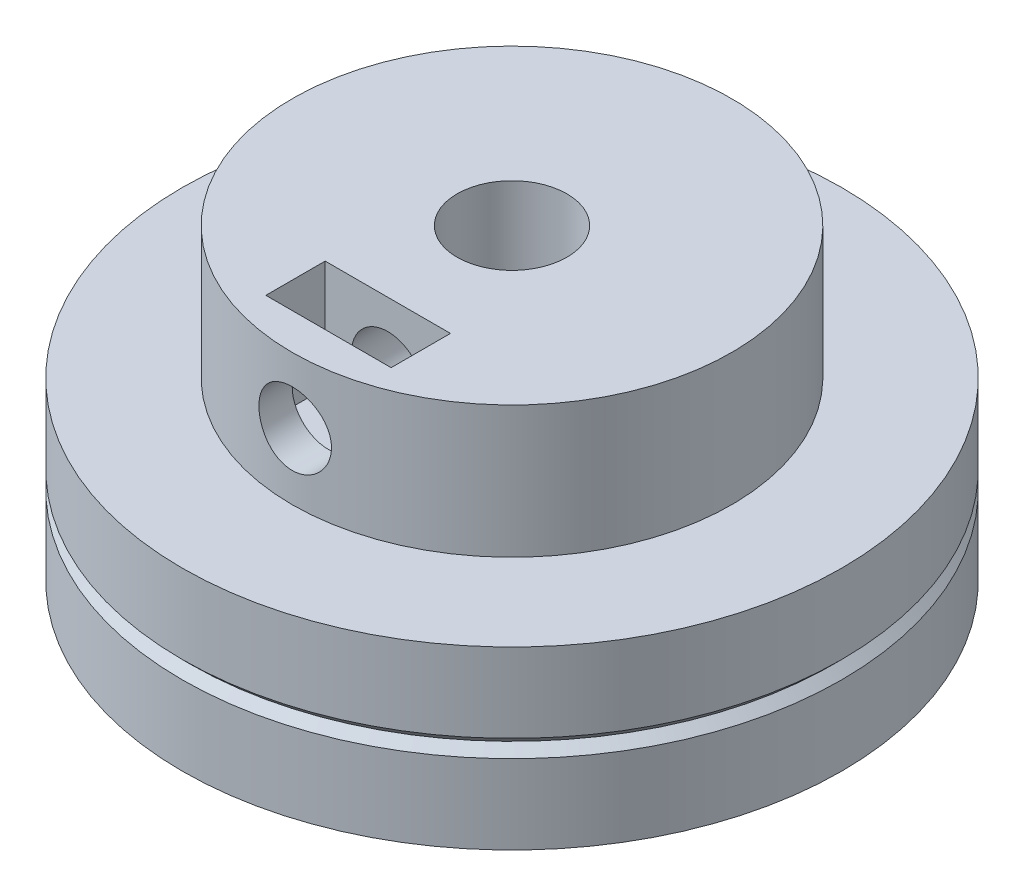
ISO-10303-21;
HEADER;
FILE_DESCRIPTION(('STEP AP214'),'2;1');
FILE_NAME('part.step','',(''),(''),'','','');
FILE_SCHEMA(('AUTOMOTIVE_DESIGN { 1 0 10303 214 1 1 1 1 }'));
ENDSEC;
DATA;
#1=APPLICATION_CONTEXT('core data for automotive mechanical design processes');
#2=APPLICATION_PROTOCOL_DEFINITION('international standard','automotive_design',2000,#1);
#3=PRODUCT_CONTEXT('',#1,'mechanical');
#4=PRODUCT('Part','Part','',(#3));
#5=PRODUCT_RELATED_PRODUCT_CATEGORY('part','',(#4));
#6=PRODUCT_DEFINITION_FORMATION('','',#4);
#7=PRODUCT_DEFINITION_CONTEXT('part definition',#1,'design');
#8=PRODUCT_DEFINITION('design','',#6,#7);
#9=PRODUCT_DEFINITION_SHAPE('','',#8);
#10=(LENGTH_UNIT() NAMED_UNIT(*) SI_UNIT(.MILLI.,.METRE.));
#11=(NAMED_UNIT(*) PLANE_ANGLE_UNIT() SI_UNIT($,.RADIAN.));
#12=(NAMED_UNIT(*) SI_UNIT($,.STERADIAN.) SOLID_ANGLE_UNIT());
#13=UNCERTAINTY_MEASURE_WITH_UNIT(LENGTH_MEASURE(1.E-05),#10,'distance_accuracy_value','');
#14=(GEOMETRIC_REPRESENTATION_CONTEXT(3) GLOBAL_UNCERTAINTY_ASSIGNED_CONTEXT((#13)) GLOBAL_UNIT_ASSIGNED_CONTEXT((#10,
#11,#12)) REPRESENTATION_CONTEXT('',''));
#15=CARTESIAN_POINT('',(0.,0.,0.));
#16=DIRECTION('',(0.,0.,1.));
#17=DIRECTION('',(1.,0.,0.));
#18=AXIS2_PLACEMENT_3D('',#15,#16,#17);
#19=CARTESIAN_POINT('',(0.,0.,0.));
#20=DIRECTION('',(0.,-1.,0.));
#21=DIRECTION('',(0.,0.,-1.));
#22=AXIS2_PLACEMENT_3D('',#19,#20,#21);
#23=CYLINDRICAL_SURFACE('',#22,2.5);
#24=CARTESIAN_POINT('',(0.,14.,0.));
#25=DIRECTION('',(0.,1.,0.));
#26=DIRECTION('',(0.,0.,1.));
#27=AXIS2_PLACEMENT_3D('',#24,#25,#26);
#28=CIRCLE('',#27,2.5);
#29=CARTESIAN_POINT('',(0.,14.,2.5));
#30=VERTEX_POINT('',#29);
#31=EDGE_CURVE('E112',#30,#30,#28,.T.);
#32=ORIENTED_EDGE('',*,*,#31,.T.);
#33=EDGE_LOOP('',(#32));
#34=FACE_BOUND('',#33,.T.);
#35=CARTESIAN_POINT('',(0.,0.,0.));
#36=DIRECTION('',(0.,-1.,0.));
#37=DIRECTION('',(0.,0.,-1.));
#38=AXIS2_PLACEMENT_3D('',#35,#36,#37);
#39=CIRCLE('',#38,2.5);
#40=CARTESIAN_POINT('',(0.,0.,-2.5));
#41=VERTEX_POINT('',#40);
#42=EDGE_CURVE('E126',#41,#41,#39,.T.);
#43=ORIENTED_EDGE('',*,*,#42,.T.);
#44=EDGE_LOOP('',(#43));
#45=FACE_BOUND('',#44,.T.);
#46=CARTESIAN_POINT('',(-1.65,11.,1.8781639970993));
#47=CARTESIAN_POINT('',(-1.64999443072167,10.9192057234402,1.87817356740867));
#48=CARTESIAN_POINT('',(-1.64401449371116,10.8383736309442,1.88347418282792));
#49=CARTESIAN_POINT('',(-1.62058860250623,10.6795820493947,1.90365752241832));
#50=CARTESIAN_POINT('',(-1.60312206083479,10.6016279840841,1.9185574504896));
#51=CARTESIAN_POINT('',(-1.55807727538571,10.4513666684178,1.95530612756548));
#52=CARTESIAN_POINT('',(-1.53059477126484,10.3790135684947,1.97708883218856));
#53=CARTESIAN_POINT('',(-1.46657517741326,10.2400547526192,2.02503214275444));
#54=CARTESIAN_POINT('',(-1.43003610611276,10.1734502987715,2.05119370638085));
#55=CARTESIAN_POINT('',(-1.342483593019,10.0367826331232,2.10971828562919));
#56=CARTESIAN_POINT('',(-1.29011420470095,9.96773272348993,2.14241946389367));
#57=CARTESIAN_POINT('',(-1.17514144468482,9.83852285385609,2.20758221587981));
#58=CARTESIAN_POINT('',(-1.11252840012499,9.77837139970331,2.24004353252863));
#59=CARTESIAN_POINT('',(-0.968234915676896,9.66026728380111,2.3064419767716));
#60=CARTESIAN_POINT('',(-0.88511164804192,9.60380909636231,2.33994640603816));
#61=CARTESIAN_POINT('',(-0.707908997031475,9.50615884571344,2.39949293751456));
#62=CARTESIAN_POINT('',(-0.613841755901939,9.46495007175718,2.42554320107045));
#63=CARTESIAN_POINT('',(-0.428365536633283,9.40392638773328,2.46464353514927));
#64=CARTESIAN_POINT('',(-0.337811072451688,9.38225085051056,2.47881191391302));
#65=CARTESIAN_POINT('',(-0.153380704926461,9.35450985288345,2.49700266516609));
#66=CARTESIAN_POINT('',(-0.0595090091735696,9.34842528975624,2.50103745363967));
#67=CARTESIAN_POINT('',(0.113712663637903,9.35199137537904,2.49868729659539));
#68=CARTESIAN_POINT('',(0.19314050029094,9.35943066791314,2.49376656842582));
#69=CARTESIAN_POINT('',(0.349338308191109,9.38546307542178,2.47671798966374));
#70=CARTESIAN_POINT('',(0.426108083336223,9.40405701149819,2.46458960851095));
#71=CARTESIAN_POINT('',(0.574862419576157,9.45141471587266,2.4341916732427));
#72=CARTESIAN_POINT('',(0.646859815580458,9.48014977277161,2.41593946394568));
#73=CARTESIAN_POINT('',(0.785017034503291,9.54668210407176,2.37464804586783));
#74=CARTESIAN_POINT('',(0.851175752075163,9.5844810893931,2.35160793342517));
#75=CARTESIAN_POINT('',(0.985047000791315,9.6735518083649,2.29902245001356));
#76=CARTESIAN_POINT('',(1.05183695764556,9.72593769862122,2.26902056419845));
#77=CARTESIAN_POINT('',(1.17625968695308,9.83980977224161,2.20709218917539));
#78=CARTESIAN_POINT('',(1.23387810796581,9.90130993266576,2.17516278943164));
#79=CARTESIAN_POINT('',(1.34724934289722,10.0424930974257,2.10711048312634));
#80=CARTESIAN_POINT('',(1.40139996434747,10.1235193024251,2.07108428413495));
#81=CARTESIAN_POINT('',(1.49525229324493,10.2955297771647,2.00437957659369));
#82=CARTESIAN_POINT('',(1.53497883258692,10.3864965788585,1.97369192533599));
#83=CARTESIAN_POINT('',(1.58906609884218,10.5499509882004,1.93021206234818));
#84=CARTESIAN_POINT('',(1.60742065844978,10.6204169380593,1.91481376393406));
#85=CARTESIAN_POINT('',(1.63471528383589,10.764315161759,1.89156962487725));
#86=CARTESIAN_POINT('',(1.64367111218458,10.8377422539691,1.88371114114999));
#87=CARTESIAN_POINT('',(1.65161100823905,10.9858610189647,1.87675635499969));
#88=CARTESIAN_POINT('',(1.65055550398267,11.0605565441797,1.87769482426887));
#89=CARTESIAN_POINT('',(1.63845508785892,11.2085332921471,1.88825914723376));
#90=CARTESIAN_POINT('',(1.62740194790477,11.2818132991779,1.89789215655035));
#91=CARTESIAN_POINT('',(1.59670654181039,11.4218439300525,1.9237732078827));
#92=CARTESIAN_POINT('',(1.57745493961549,11.4887398433019,1.93971829428859));
#93=CARTESIAN_POINT('',(1.53127715983159,11.6184117896935,1.97637475195714));
#94=CARTESIAN_POINT('',(1.5043484373163,11.681186448157,1.99708770330353));
#95=CARTESIAN_POINT('',(1.43744371796297,11.8141534662888,2.0459202403853));
#96=CARTESIAN_POINT('',(1.39593741519332,11.8833337223822,2.07469338349939));
#97=CARTESIAN_POINT('',(1.30370192953133,12.0145459964164,2.13386307226144));
#98=CARTESIAN_POINT('',(1.25296152557762,12.0765691657302,2.16426156090021));
#99=CARTESIAN_POINT('',(1.13132559349668,12.2049772069055,2.23066104299161));
#100=CARTESIAN_POINT('',(1.05843368437052,12.2695717443052,2.26650752858329));
#101=CARTESIAN_POINT('',(0.90102913614525,12.3857070551583,2.33354741548986));
#102=CARTESIAN_POINT('',(0.816527594120815,12.4372601621495,2.36474520160667));
#103=CARTESIAN_POINT('',(0.655022436944625,12.5165370380318,2.41383928477657));
#104=CARTESIAN_POINT('',(0.579766982761504,12.5469467938352,2.43314294605933));
#105=CARTESIAN_POINT('',(0.424305717798106,12.5965922999571,2.46500344203446));
#106=CARTESIAN_POINT('',(0.344104114697723,12.6158374068328,2.47756592552063));
#107=CARTESIAN_POINT('',(0.18053205750148,12.6421922081214,2.49483359194805));
#108=CARTESIAN_POINT('',(0.0971499203468121,12.6492516330168,2.49950622522129));
#109=CARTESIAN_POINT('',(-0.0697703046886348,12.6506347827418,2.50041880991432));
#110=CARTESIAN_POINT('',(-0.153308385299492,12.6449590871512,2.49665914509096));
#111=CARTESIAN_POINT('',(-0.312248842068657,12.6220405182467,2.48162224491364));
#112=CARTESIAN_POINT('',(-0.387820405838227,12.6056017320266,2.47086791156197));
#113=CARTESIAN_POINT('',(-0.534890956581191,12.562773836475,2.44325497490618));
#114=CARTESIAN_POINT('',(-0.606389301510781,12.5363831634387,2.42639541232541));
#115=CARTESIAN_POINT('',(-0.748299731069992,12.4727430328114,2.38659098522815));
#116=CARTESIAN_POINT('',(-0.818362050887251,12.4349160468192,2.36333062488106));
#117=CARTESIAN_POINT('',(-0.951399734920276,12.3503924158581,2.31298664760704));
#118=CARTESIAN_POINT('',(-1.01437047747239,12.3036900393604,2.2859005630314));
#119=CARTESIAN_POINT('',(-1.14186276834818,12.1944709248474,2.2252813274897));
#120=CARTESIAN_POINT('',(-1.20508031729177,12.1306227982526,2.19140310364951));
#121=CARTESIAN_POINT('',(-1.32046767601712,11.9934316595585,2.12387294022856));
#122=CARTESIAN_POINT('',(-1.37263030790415,11.9200825279986,2.09022116132146));
#123=CARTESIAN_POINT('',(-1.46053735742483,11.7720267980174,2.02963185186414));
#124=CARTESIAN_POINT('',(-1.49736813204505,11.6981050422354,2.00236030827309));
#125=CARTESIAN_POINT('',(-1.55999123252305,11.5438908671167,1.95397052678842));
#126=CARTESIAN_POINT('',(-1.58580711054237,11.4636124801069,1.93283919103843));
#127=CARTESIAN_POINT('',(-1.62004735146957,11.3193086031863,1.90415675714692));
#128=CARTESIAN_POINT('',(-1.63122690692698,11.2563530923931,1.89451740482451));
#129=CARTESIAN_POINT('',(-1.64620346660995,11.1289391981775,1.88151889606352));
#130=CARTESIAN_POINT('',(-1.65000444482247,11.0644816426758,1.8781563590673));
#131=CARTESIAN_POINT('',(-1.65,11.,1.8781639970993));
#132=B_SPLINE_CURVE_WITH_KNOTS('',3,(#46,#47,#48,#49,#50,#51,#52,#53,#54,#55,#56,#57,#58,#59,
#60,#61,#62,#63,#64,#65,#66,#67,#68,#69,#70,#71,#72,#73,#74,#75,#76,#77,#78,#79,#80,#81,#82,#83,
#84,#85,#86,#87,#88,#89,#90,#91,#92,#93,#94,#95,#96,#97,#98,#99,#100,#101,#102,#103,#104,#105,
#106,#107,#108,#109,#110,#111,#112,#113,#114,#115,#116,#117,#118,#119,#120,#121,#122,#123,#124,
#125,#126,#127,#128,#129,#130,#131),.UNSPECIFIED.,.T.,.F.,(4,2,2,2,2,2,2,2,2,2,2,2,2,2,2,2,2,2,
2,2,2,2,2,2,2,2,2,2,2,2,2,2,2,2,2,2,2,2,2,2,2,2,4),(0.,0.242089089232211,0.484613262365226,
0.724877542229122,0.965194438206269,1.24204242334406,1.51915335508711,1.83517136959405,
2.15084204970881,2.43163690958527,2.71208756281943,2.95071293244791,3.18935586962918,
3.42732851395791,3.66534611375404,3.93440451568685,4.20387988176701,4.51414003592555,
4.82386349786491,5.04625677123861,5.26827647088755,5.49117411610794,5.71425537389904,
5.92772322794786,6.14126192794926,6.39732261532284,6.65369656488884,6.96356575078112,
7.27314078239638,7.52238413686411,7.77141830954324,8.02147738775788,8.27152508592675,
8.5047464160132,8.73800440662637,8.98590102363147,9.23395827408612,9.52089661145365,
9.80802068929724,10.067982581361,10.3273858003361,10.520700440269,10.7139109350251),.UNSPECIFIED.);
#133=CARTESIAN_POINT('',(-1.65,11.,1.8781639970993));
#134=VERTEX_POINT('',#133);
#135=EDGE_CURVE('E106',#134,#134,#132,.T.);
#136=ORIENTED_EDGE('',*,*,#135,.T.);
#137=EDGE_LOOP('',(#136));
#138=FACE_BOUND('',#137,.T.);
#139=ADVANCED_FACE('F33',(#34,#45,#138),#23,.F.);
#140=CARTESIAN_POINT('',(0.,14.,0.));
#141=DIRECTION('',(0.,-1.,0.));
#142=DIRECTION('',(0.,0.,-1.));
#143=AXIS2_PLACEMENT_3D('',#140,#141,#142);
#144=CYLINDRICAL_SURFACE('',#143,10.);
#145=CARTESIAN_POINT('',(0.,14.,0.));
#146=DIRECTION('',(0.,1.,0.));
#147=DIRECTION('',(0.,0.,1.));
#148=AXIS2_PLACEMENT_3D('',#145,#146,#147);
#149=CIRCLE('',#148,10.);
#150=CARTESIAN_POINT('',(0.,14.,10.));
#151=VERTEX_POINT('',#150);
#152=EDGE_CURVE('E118',#151,#151,#149,.T.);
#153=ORIENTED_EDGE('',*,*,#152,.F.);
#154=EDGE_LOOP('',(#153));
#155=FACE_BOUND('',#154,.T.);
#156=CARTESIAN_POINT('',(0.,8.,0.));
#157=DIRECTION('',(0.,1.,0.));
#158=DIRECTION('',(0.,0.,1.));
#159=AXIS2_PLACEMENT_3D('',#156,#157,#158);
#160=CIRCLE('',#159,10.);
#161=CARTESIAN_POINT('',(0.,8.,10.));
#162=VERTEX_POINT('',#161);
#163=EDGE_CURVE('E117',#162,#162,#160,.T.);
#164=ORIENTED_EDGE('',*,*,#163,.T.);
#165=EDGE_LOOP('',(#164));
#166=FACE_BOUND('',#165,.T.);
#167=CARTESIAN_POINT('',(-1.65,11.,9.86293566845085));
#168=CARTESIAN_POINT('',(-1.64999629098035,10.9079981576341,9.86293731785559));
#169=CARTESIAN_POINT('',(-1.64227909123111,10.8159457429534,9.86423691212932));
#170=CARTESIAN_POINT('',(-1.61162706431046,10.6344227866581,9.86929026153225));
#171=CARTESIAN_POINT('',(-1.58867811875357,10.5449547208521,9.8730462934991));
#172=CARTESIAN_POINT('',(-1.52827489499291,10.3712538233845,9.88257579035621));
#173=CARTESIAN_POINT('',(-1.49083263568619,10.2870167208233,9.88834758324599));
#174=CARTESIAN_POINT('',(-1.40253539774319,10.1260297755274,9.90125628915054));
#175=CARTESIAN_POINT('',(-1.3516819635744,10.0492790720318,9.90839304494647));
#176=CARTESIAN_POINT('',(-1.23748166219591,9.90469249754825,9.92330460813677));
#177=CARTESIAN_POINT('',(-1.17403055174128,9.83693946492918,9.93108439980271));
#178=CARTESIAN_POINT('',(-1.03666129953611,9.71299083427328,9.94636114892746));
#179=CARTESIAN_POINT('',(-0.962742542660854,9.65679591591812,9.95385808973191));
#180=CARTESIAN_POINT('',(-0.806000158090803,9.55724831658915,9.96777711815929));
#181=CARTESIAN_POINT('',(-0.723126989054621,9.51397264811038,9.97419266457576));
#182=CARTESIAN_POINT('',(-0.551164106325251,9.44198691122183,9.98517060701297));
#183=CARTESIAN_POINT('',(-0.462074789289345,9.41327591439407,9.98973312115065));
#184=CARTESIAN_POINT('',(-0.28106409311301,9.37148765336425,9.99645574381605));
#185=CARTESIAN_POINT('',(-0.189175642116499,9.35827125081373,9.99863722113475));
#186=CARTESIAN_POINT('',(-0.00446128175041789,9.34741474747605,10.0004253754509));
#187=CARTESIAN_POINT('',(0.0883645646994452,9.34977360809646,10.0000322241302));
#188=CARTESIAN_POINT('',(0.271367618037822,9.36989202770408,9.9967323508907));
#189=CARTESIAN_POINT('',(0.361561789664356,9.38750185181637,9.99385006818958));
#190=CARTESIAN_POINT('',(0.537697224998587,9.43738661870974,9.98592303427217));
#191=CARTESIAN_POINT('',(0.623638361119402,9.46966200114778,9.98087821822581));
#192=CARTESIAN_POINT('',(0.789274301179366,9.54811098155924,9.96915130593382));
#193=CARTESIAN_POINT('',(0.868939282087196,9.59434641796588,9.96246194992932));
#194=CARTESIAN_POINT('',(1.01943645906903,9.69935776294152,9.9481893971331));
#195=CARTESIAN_POINT('',(1.09026795344527,9.75813466675174,9.94060612942547));
#196=CARTESIAN_POINT('',(1.22197197095426,9.88739135719332,9.92528291081511));
#197=CARTESIAN_POINT('',(1.28271604906533,9.95800199873008,9.9175421690508));
#198=CARTESIAN_POINT('',(1.3915146973154,10.1084805032595,9.90286372793617));
#199=CARTESIAN_POINT('',(1.43956915487058,10.1883484483751,9.89592603571091));
#200=CARTESIAN_POINT('',(1.52164889999091,10.355221793782,9.88363886477131));
#201=CARTESIAN_POINT('',(1.55565895856361,10.4422348199318,9.87829111185156));
#202=CARTESIAN_POINT('',(1.60854450758027,10.6208466002868,9.86981807463769));
#203=CARTESIAN_POINT('',(1.62742130248435,10.7124449585214,9.8666925987899));
#204=CARTESIAN_POINT('',(1.64932410589818,10.8964786950777,9.86305497953645));
#205=CARTESIAN_POINT('',(1.6525331076067,10.9888917175602,9.86251266770398));
#206=CARTESIAN_POINT('',(1.64349666278561,11.172934586635,9.86402245062659));
#207=CARTESIAN_POINT('',(1.63125180079262,11.2645644627175,9.86607444725293));
#208=CARTESIAN_POINT('',(1.59181115051361,11.4438602131991,9.87251378234871));
#209=CARTESIAN_POINT('',(1.56470830150066,11.5315470996018,9.87688659832881));
#210=CARTESIAN_POINT('',(1.49641841835946,11.701134207593,9.88746270071878));
#211=CARTESIAN_POINT('',(1.45523055679537,11.783034088878,9.89366609466455));
#212=CARTESIAN_POINT('',(1.35950711966145,11.9395373891755,9.90727458613196));
#213=CARTESIAN_POINT('',(1.3048541529275,12.0140680898705,9.9146900482088));
#214=CARTESIAN_POINT('',(1.183913241756,12.1529660250689,9.92985673064712));
#215=CARTESIAN_POINT('',(1.11762449587139,12.2173325589063,9.93760797410877));
#216=CARTESIAN_POINT('',(0.974483484791726,12.3347420980801,9.95266815580003));
#217=CARTESIAN_POINT('',(0.89753054266093,12.3876631457658,9.95997178743297));
#218=CARTESIAN_POINT('',(0.735720107735903,12.4798257056577,9.97322896699239));
#219=CARTESIAN_POINT('',(0.650862866786064,12.5190676535144,9.97918255791273));
#220=CARTESIAN_POINT('',(0.47601685287779,12.5825677643451,9.98904576356827));
#221=CARTESIAN_POINT('',(0.386051879990878,12.6068900452976,9.99296411355053));
#222=CARTESIAN_POINT('',(0.203244410238656,12.6400669736001,9.99835224840596));
#223=CARTESIAN_POINT('',(0.110402145843635,12.6489228672556,9.99982223057197));
#224=CARTESIAN_POINT('',(-0.0743467418035993,12.6508803393271,10.000145298838));
#225=CARTESIAN_POINT('',(-0.166251396930961,12.6441675878556,9.99902922611947));
#226=CARTESIAN_POINT('',(-0.347605270735732,12.615579538088,9.99436846725468));
#227=CARTESIAN_POINT('',(-0.437054502497685,12.5937043206064,9.99082379405267));
#228=CARTESIAN_POINT('',(-0.610889563964937,12.5354829925932,9.98170266675398));
#229=CARTESIAN_POINT('',(-0.695280700367394,12.4991523649413,9.97612838706588));
#230=CARTESIAN_POINT('',(-0.856798143174388,12.4130720878686,9.96355694814414));
#231=CARTESIAN_POINT('',(-0.933924116084176,12.3633218228474,9.95655972363921));
#232=CARTESIAN_POINT('',(-1.07965789685337,12.2511549000613,9.94181931422729));
#233=CARTESIAN_POINT('',(-1.14816021705336,12.188602157851,9.93406862876239));
#234=CARTESIAN_POINT('',(-1.27376166628459,12.0528916278078,9.91874715128115));
#235=CARTESIAN_POINT('',(-1.33085812058581,11.9797313593849,9.91117640182651));
#236=CARTESIAN_POINT('',(-1.43238917357863,11.8242821742307,9.8970154548119));
#237=CARTESIAN_POINT('',(-1.47673345800305,11.7419336147193,9.89043240198641));
#238=CARTESIAN_POINT('',(-1.55089189624869,11.570881962986,9.87907656402569));
#239=CARTESIAN_POINT('',(-1.58072062483372,11.4821853478159,9.87430196413345));
#240=CARTESIAN_POINT('',(-1.61849251524499,11.3276147004637,9.86816715424855));
#241=CARTESIAN_POINT('',(-1.63028895802674,11.2626786349741,9.86621620214801));
#242=CARTESIAN_POINT('',(-1.64604396057966,11.1318370256308,9.86359987952975));
#243=CARTESIAN_POINT('',(-1.65000265800356,11.065931498824,9.86293448643401));
#244=CARTESIAN_POINT('',(-1.65,11.,9.86293566845085));
#245=B_SPLINE_CURVE_WITH_KNOTS('',3,(#167,#168,#169,#170,#171,#172,#173,#174,#175,#176,#177,
#178,#179,#180,#181,#182,#183,#184,#185,#186,#187,#188,#189,#190,#191,#192,#193,#194,#195,#196,
#197,#198,#199,#200,#201,#202,#203,#204,#205,#206,#207,#208,#209,#210,#211,#212,#213,#214,#215,
#216,#217,#218,#219,#220,#221,#222,#223,#224,#225,#226,#227,#228,#229,#230,#231,#232,#233,#234,
#235,#236,#237,#238,#239,#240,#241,#242,#243,#244),.UNSPECIFIED.,.T.,.F.,(4,2,2,2,2,2,2,2,2,2,2,
2,2,2,2,2,2,2,2,2,2,2,2,2,2,2,2,2,2,2,2,2,2,2,2,2,2,2,4),(0.,0.275764439202396,
0.551784843546748,0.827576840629575,1.10333709061229,1.38148219258883,1.65964364637686,
1.9394315673533,2.2192016511418,2.49643973106729,2.77365932434104,3.0481876234325,
3.32272415311684,3.59849508924516,3.87428791760822,4.15336037881899,4.4324353159104,
4.71181207725748,4.99116475423999,5.26724677423095,5.54331835183579,5.81768243813567,
6.09206264495278,6.36892529029642,6.64580701282283,6.92550769092015,7.20519946032494,
7.48368066222358,7.76213942263839,8.0372944153401,8.31244794150179,8.58730754656389,
8.86217976243821,9.14014153059558,9.41816840579303,9.69811840194762,9.97778672322852,
10.175411919191,10.3730336442719),.UNSPECIFIED.);
#246=CARTESIAN_POINT('',(-1.65,11.,9.86293566845085));
#247=VERTEX_POINT('',#246);
#248=EDGE_CURVE('E172',#247,#247,#245,.T.);
#249=ORIENTED_EDGE('',*,*,#248,.F.);
#250=EDGE_LOOP('',(#249));
#251=FACE_BOUND('',#250,.T.);
#252=ADVANCED_FACE('F153',(#155,#166,#251),#144,.T.);
#253=CARTESIAN_POINT('',(2.5,8.,0.));
#254=DIRECTION('',(0.,1.,0.));
#255=DIRECTION('',(0.,0.,1.));
#256=AXIS2_PLACEMENT_3D('',#253,#254,#255);
#257=PLANE('',#256);
#258=CARTESIAN_POINT('',(0.,8.,0.));
#259=DIRECTION('',(0.,-1.,0.));
#260=DIRECTION('',(0.,0.,-1.));
#261=AXIS2_PLACEMENT_3D('',#258,#259,#260);
#262=CIRCLE('',#261,15.);
#263=CARTESIAN_POINT('',(0.,8.,-15.));
#264=VERTEX_POINT('',#263);
#265=EDGE_CURVE('E121',#264,#264,#262,.T.);
#266=ORIENTED_EDGE('',*,*,#265,.F.);
#267=EDGE_LOOP('',(#266));
#268=FACE_BOUND('',#267,.T.);
#269=ORIENTED_EDGE('',*,*,#163,.F.);
#270=EDGE_LOOP('',(#269));
#271=FACE_BOUND('',#270,.T.);
#272=ADVANCED_FACE('F150',(#268,#271),#257,.T.);
#273=CARTESIAN_POINT('',(0.,0.,0.));
#274=DIRECTION('',(0.,-1.,0.));
#275=DIRECTION('',(0.,0.,-1.));
#276=AXIS2_PLACEMENT_3D('',#273,#274,#275);
#277=CYLINDRICAL_SURFACE('',#276,15.);
#278=ORIENTED_EDGE('',*,*,#265,.T.);
#279=EDGE_LOOP('',(#278));
#280=FACE_BOUND('',#279,.T.);
#281=CARTESIAN_POINT('',(0.,4.4,0.));
#282=DIRECTION('',(0.,-1.,0.));
#283=DIRECTION('',(0.,0.,-1.));
#284=AXIS2_PLACEMENT_3D('',#281,#282,#283);
#285=CIRCLE('',#284,15.);
#286=CARTESIAN_POINT('',(0.,4.4,-15.));
#287=VERTEX_POINT('',#286);
#288=EDGE_CURVE('E11',#287,#287,#285,.T.);
#289=ORIENTED_EDGE('',*,*,#288,.F.);
#290=EDGE_LOOP('',(#289));
#291=FACE_BOUND('',#290,.T.);
#292=ADVANCED_FACE('F35',(#280,#291),#277,.T.);
#293=CARTESIAN_POINT('',(0.,4.,0.));
#294=DIRECTION('',(0.,1.,0.));
#295=DIRECTION('',(0.,0.,1.));
#296=AXIS2_PLACEMENT_3D('',#293,#294,#295);
#297=CONICAL_SURFACE('',#296,14.6,0.785398163397449);
#298=ORIENTED_EDGE('',*,*,#288,.T.);
#299=EDGE_LOOP('',(#298));
#300=FACE_BOUND('',#299,.T.);
#301=CARTESIAN_POINT('',(0.,4.,0.));
#302=DIRECTION('',(0.,-1.,0.));
#303=DIRECTION('',(0.,0.,-1.));
#304=AXIS2_PLACEMENT_3D('',#301,#302,#303);
#305=CIRCLE('',#304,14.6);
#306=CARTESIAN_POINT('',(0.,4.,-14.6));
#307=VERTEX_POINT('',#306);
#308=EDGE_CURVE('E42',#307,#307,#305,.T.);
#309=ORIENTED_EDGE('',*,*,#308,.F.);
#310=EDGE_LOOP('',(#309));
#311=FACE_BOUND('',#310,.T.);
#312=ADVANCED_FACE('F141',(#300,#311),#297,.T.);
#313=CARTESIAN_POINT('',(0.,3.6,0.));
#314=DIRECTION('',(0.,-1.,0.));
#315=DIRECTION('',(0.,0.,-1.));
#316=AXIS2_PLACEMENT_3D('',#313,#314,#315);
#317=CONICAL_SURFACE('',#316,15.,0.785398163397449);
#318=ORIENTED_EDGE('',*,*,#308,.T.);
#319=EDGE_LOOP('',(#318));
#320=FACE_BOUND('',#319,.T.);
#321=CARTESIAN_POINT('',(0.,3.6,0.));
#322=DIRECTION('',(0.,-1.,0.));
#323=DIRECTION('',(0.,0.,-1.));
#324=AXIS2_PLACEMENT_3D('',#321,#322,#323);
#325=CIRCLE('',#324,15.);
#326=CARTESIAN_POINT('',(0.,3.6,-15.));
#327=VERTEX_POINT('',#326);
#328=EDGE_CURVE('E132',#327,#327,#325,.T.);
#329=ORIENTED_EDGE('',*,*,#328,.F.);
#330=EDGE_LOOP('',(#329));
#331=FACE_BOUND('',#330,.T.);
#332=ADVANCED_FACE('F138',(#320,#331),#317,.T.);
#333=CARTESIAN_POINT('',(0.,0.,0.));
#334=DIRECTION('',(0.,-1.,0.));
#335=DIRECTION('',(0.,0.,-1.));
#336=AXIS2_PLACEMENT_3D('',#333,#334,#335);
#337=CYLINDRICAL_SURFACE('',#336,15.);
#338=ORIENTED_EDGE('',*,*,#328,.T.);
#339=EDGE_LOOP('',(#338));
#340=FACE_BOUND('',#339,.T.);
#341=CARTESIAN_POINT('',(0.,0.,0.));
#342=DIRECTION('',(0.,-1.,0.));
#343=DIRECTION('',(0.,0.,-1.));
#344=AXIS2_PLACEMENT_3D('',#341,#342,#343);
#345=CIRCLE('',#344,15.);
#346=CARTESIAN_POINT('',(0.,0.,-15.));
#347=VERTEX_POINT('',#346);
#348=EDGE_CURVE('E129',#347,#347,#345,.T.);
#349=ORIENTED_EDGE('',*,*,#348,.F.);
#350=EDGE_LOOP('',(#349));
#351=FACE_BOUND('',#350,.T.);
#352=ADVANCED_FACE('F148',(#340,#351),#337,.T.);
#353=CARTESIAN_POINT('',(15.,0.,0.));
#354=DIRECTION('',(0.,-1.,0.));
#355=DIRECTION('',(0.,0.,-1.));
#356=AXIS2_PLACEMENT_3D('',#353,#354,#355);
#357=PLANE('',#356);
#358=ORIENTED_EDGE('',*,*,#348,.T.);
#359=EDGE_LOOP('',(#358));
#360=FACE_BOUND('',#359,.T.);
#361=ORIENTED_EDGE('',*,*,#42,.F.);
#362=EDGE_LOOP('',(#361));
#363=FACE_BOUND('',#362,.T.);
#364=ADVANCED_FACE('F165',(#360,#363),#357,.T.);
#365=CARTESIAN_POINT('',(0.,14.,0.));
#366=DIRECTION('',(0.,1.,0.));
#367=DIRECTION('',(0.,0.,1.));
#368=AXIS2_PLACEMENT_3D('',#365,#366,#367);
#369=PLANE('',#368);
#370=DIRECTION('',(0.,0.,-1.));
#371=VECTOR('',#370,1.);
#372=CARTESIAN_POINT('',(2.85,14.,8.35));
#373=LINE('',#372,#371);
#374=CARTESIAN_POINT('',(2.85,14.,8.35));
#375=VERTEX_POINT('',#374);
#376=CARTESIAN_POINT('',(2.85,14.,5.65));
#377=VERTEX_POINT('',#376);
#378=EDGE_CURVE('E49',#375,#377,#373,.T.);
#379=ORIENTED_EDGE('',*,*,#378,.F.);
#380=DIRECTION('',(1.,0.,0.));
#381=VECTOR('',#380,1.);
#382=CARTESIAN_POINT('',(-2.85,14.,8.35));
#383=LINE('',#382,#381);
#384=CARTESIAN_POINT('',(-2.85,14.,8.35));
#385=VERTEX_POINT('',#384);
#386=EDGE_CURVE('E100',#385,#375,#383,.T.);
#387=ORIENTED_EDGE('',*,*,#386,.F.);
#388=DIRECTION('',(0.,0.,1.));
#389=VECTOR('',#388,1.);
#390=CARTESIAN_POINT('',(-2.85,14.,8.35));
#391=LINE('',#390,#389);
#392=CARTESIAN_POINT('',(-2.85,14.,5.65));
#393=VERTEX_POINT('',#392);
#394=EDGE_CURVE('E108',#393,#385,#391,.T.);
#395=ORIENTED_EDGE('',*,*,#394,.F.);
#396=DIRECTION('',(-1.,0.,0.));
#397=VECTOR('',#396,1.);
#398=CARTESIAN_POINT('',(-2.85,14.,5.65));
#399=LINE('',#398,#397);
#400=EDGE_CURVE('E84',#377,#393,#399,.T.);
#401=ORIENTED_EDGE('',*,*,#400,.F.);
#402=EDGE_LOOP('',(#379,#387,#395,#401));
#403=FACE_BOUND('',#402,.T.);
#404=ORIENTED_EDGE('',*,*,#152,.T.);
#405=EDGE_LOOP('',(#404));
#406=FACE_BOUND('',#405,.T.);
#407=ORIENTED_EDGE('',*,*,#31,.F.);
#408=EDGE_LOOP('',(#407));
#409=FACE_BOUND('',#408,.T.);
#410=ADVANCED_FACE('F197',(#403,#406,#409),#369,.T.);
#411=CARTESIAN_POINT('',(2.85,9.,8.35));
#412=DIRECTION('',(1.,0.,0.));
#413=DIRECTION('',(0.,0.,-1.));
#414=AXIS2_PLACEMENT_3D('',#411,#412,#413);
#415=PLANE('',#414);
#416=ORIENTED_EDGE('',*,*,#378,.T.);
#417=DIRECTION('',(0.,1.,0.));
#418=VECTOR('',#417,1.);
#419=CARTESIAN_POINT('',(2.85,9.,5.65));
#420=LINE('',#419,#418);
#421=CARTESIAN_POINT('',(2.85,9.,5.65));
#422=VERTEX_POINT('',#421);
#423=EDGE_CURVE('E72',#422,#377,#420,.T.);
#424=ORIENTED_EDGE('',*,*,#423,.F.);
#425=DIRECTION('',(0.,0.,-1.));
#426=VECTOR('',#425,1.);
#427=CARTESIAN_POINT('',(2.85,9.,8.35));
#428=LINE('',#427,#426);
#429=CARTESIAN_POINT('',(2.85,9.,8.35));
#430=VERTEX_POINT('',#429);
#431=EDGE_CURVE('E98',#430,#422,#428,.T.);
#432=ORIENTED_EDGE('',*,*,#431,.F.);
#433=DIRECTION('',(0.,1.,0.));
#434=VECTOR('',#433,1.);
#435=CARTESIAN_POINT('',(2.85,9.,8.35));
#436=LINE('',#435,#434);
#437=EDGE_CURVE('E57',#430,#375,#436,.T.);
#438=ORIENTED_EDGE('',*,*,#437,.T.);
#439=EDGE_LOOP('',(#416,#424,#432,#438));
#440=FACE_BOUND('',#439,.T.);
#441=ADVANCED_FACE('F188',(#440),#415,.F.);
#442=CARTESIAN_POINT('',(-2.85,9.,8.35));
#443=DIRECTION('',(0.,0.,1.));
#444=DIRECTION('',(1.,0.,0.));
#445=AXIS2_PLACEMENT_3D('',#442,#443,#444);
#446=PLANE('',#445);
#447=CARTESIAN_POINT('',(0.,11.,8.35));
#448=DIRECTION('',(0.,0.,1.));
#449=DIRECTION('',(1.,0.,0.));
#450=AXIS2_PLACEMENT_3D('',#447,#448,#449);
#451=CIRCLE('',#450,1.65);
#452=CARTESIAN_POINT('',(1.65,11.,8.35));
#453=VERTEX_POINT('',#452);
#454=EDGE_CURVE('E216',#453,#453,#451,.F.);
#455=ORIENTED_EDGE('',*,*,#454,.F.);
#456=EDGE_LOOP('',(#455));
#457=FACE_BOUND('',#456,.T.);
#458=ORIENTED_EDGE('',*,*,#386,.T.);
#459=ORIENTED_EDGE('',*,*,#437,.F.);
#460=DIRECTION('',(1.,0.,0.));
#461=VECTOR('',#460,1.);
#462=CARTESIAN_POINT('',(-2.85,9.,8.35));
#463=LINE('',#462,#461);
#464=CARTESIAN_POINT('',(-2.85,9.,8.35));
#465=VERTEX_POINT('',#464);
#466=EDGE_CURVE('E95',#465,#430,#463,.T.);
#467=ORIENTED_EDGE('',*,*,#466,.F.);
#468=DIRECTION('',(0.,1.,0.));
#469=VECTOR('',#468,1.);
#470=CARTESIAN_POINT('',(-2.85,9.,8.35));
#471=LINE('',#470,#469);
#472=EDGE_CURVE('E88',#465,#385,#471,.T.);
#473=ORIENTED_EDGE('',*,*,#472,.T.);
#474=EDGE_LOOP('',(#458,#459,#467,#473));
#475=FACE_BOUND('',#474,.T.);
#476=ADVANCED_FACE('F185',(#457,#475),#446,.F.);
#477=CARTESIAN_POINT('',(-2.85,9.,8.35));
#478=DIRECTION('',(-1.,0.,0.));
#479=DIRECTION('',(0.,0.,1.));
#480=AXIS2_PLACEMENT_3D('',#477,#478,#479);
#481=PLANE('',#480);
#482=ORIENTED_EDGE('',*,*,#394,.T.);
#483=ORIENTED_EDGE('',*,*,#472,.F.);
#484=DIRECTION('',(0.,0.,1.));
#485=VECTOR('',#484,1.);
#486=CARTESIAN_POINT('',(-2.85,9.,8.35));
#487=LINE('',#486,#485);
#488=CARTESIAN_POINT('',(-2.85,9.,5.65));
#489=VERTEX_POINT('',#488);
#490=EDGE_CURVE('E91',#489,#465,#487,.T.);
#491=ORIENTED_EDGE('',*,*,#490,.F.);
#492=DIRECTION('',(0.,1.,0.));
#493=VECTOR('',#492,1.);
#494=CARTESIAN_POINT('',(-2.85,9.,5.65));
#495=LINE('',#494,#493);
#496=EDGE_CURVE('E77',#489,#393,#495,.T.);
#497=ORIENTED_EDGE('',*,*,#496,.T.);
#498=EDGE_LOOP('',(#482,#483,#491,#497));
#499=FACE_BOUND('',#498,.T.);
#500=ADVANCED_FACE('F92',(#499),#481,.F.);
#501=CARTESIAN_POINT('',(-2.85,9.,5.65));
#502=DIRECTION('',(0.,0.,-1.));
#503=DIRECTION('',(-1.,0.,0.));
#504=AXIS2_PLACEMENT_3D('',#501,#502,#503);
#505=PLANE('',#504);
#506=CARTESIAN_POINT('',(0.,11.,5.65));
#507=DIRECTION('',(0.,0.,-1.));
#508=DIRECTION('',(-1.,0.,0.));
#509=AXIS2_PLACEMENT_3D('',#506,#507,#508);
#510=CIRCLE('',#509,1.65);
#511=CARTESIAN_POINT('',(-1.65,11.,5.65));
#512=VERTEX_POINT('',#511);
#513=EDGE_CURVE('E37',#512,#512,#510,.F.);
#514=ORIENTED_EDGE('',*,*,#513,.F.);
#515=EDGE_LOOP('',(#514));
#516=FACE_BOUND('',#515,.T.);
#517=ORIENTED_EDGE('',*,*,#400,.T.);
#518=ORIENTED_EDGE('',*,*,#496,.F.);
#519=DIRECTION('',(-1.,0.,0.));
#520=VECTOR('',#519,1.);
#521=CARTESIAN_POINT('',(-2.85,9.,5.65));
#522=LINE('',#521,#520);
#523=EDGE_CURVE('E81',#422,#489,#522,.T.);
#524=ORIENTED_EDGE('',*,*,#523,.F.);
#525=ORIENTED_EDGE('',*,*,#423,.T.);
#526=EDGE_LOOP('',(#517,#518,#524,#525));
#527=FACE_BOUND('',#526,.T.);
#528=ADVANCED_FACE('F79',(#516,#527),#505,.F.);
#529=CARTESIAN_POINT('',(0.,9.,0.));
#530=DIRECTION('',(0.,-1.,0.));
#531=DIRECTION('',(0.,0.,-1.));
#532=AXIS2_PLACEMENT_3D('',#529,#530,#531);
#533=PLANE('',#532);
#534=ORIENTED_EDGE('',*,*,#431,.T.);
#535=ORIENTED_EDGE('',*,*,#523,.T.);
#536=ORIENTED_EDGE('',*,*,#490,.T.);
#537=ORIENTED_EDGE('',*,*,#466,.T.);
#538=EDGE_LOOP('',(#534,#535,#536,#537));
#539=FACE_BOUND('',#538,.T.);
#540=ADVANCED_FACE('F97',(#539),#533,.F.);
#541=CARTESIAN_POINT('',(0.,11.,35.));
#542=DIRECTION('',(0.,0.,-1.));
#543=DIRECTION('',(-1.,0.,0.));
#544=AXIS2_PLACEMENT_3D('',#541,#542,#543);
#545=CYLINDRICAL_SURFACE('',#544,1.65);
#546=ORIENTED_EDGE('',*,*,#135,.F.);
#547=EDGE_LOOP('',(#546));
#548=FACE_BOUND('',#547,.T.);
#549=ORIENTED_EDGE('',*,*,#513,.T.);
#550=EDGE_LOOP('',(#549));
#551=FACE_BOUND('',#550,.T.);
#552=ADVANCED_FACE('F180',(#548,#551),#545,.F.);
#553=ORIENTED_EDGE('',*,*,#454,.T.);
#554=EDGE_LOOP('',(#553));
#555=FACE_BOUND('',#554,.T.);
#556=ORIENTED_EDGE('',*,*,#248,.T.);
#557=EDGE_LOOP('',(#556));
#558=FACE_BOUND('',#557,.T.);
#559=ADVANCED_FACE('F176',(#555,#558),#545,.F.);
#560=CLOSED_SHELL('',(#139,#252,#272,#292,#312,#332,#352,#364,#410,#441,#476,#500,#528,#540,
#552,#559));
#561=MANIFOLD_SOLID_BREP('B2',#560);
#562=ADVANCED_BREP_SHAPE_REPRESENTATION('',(#18,#561),#14);
#563=SHAPE_DEFINITION_REPRESENTATION(#9,#562);
ENDSEC;
END-ISO-10303-21;
